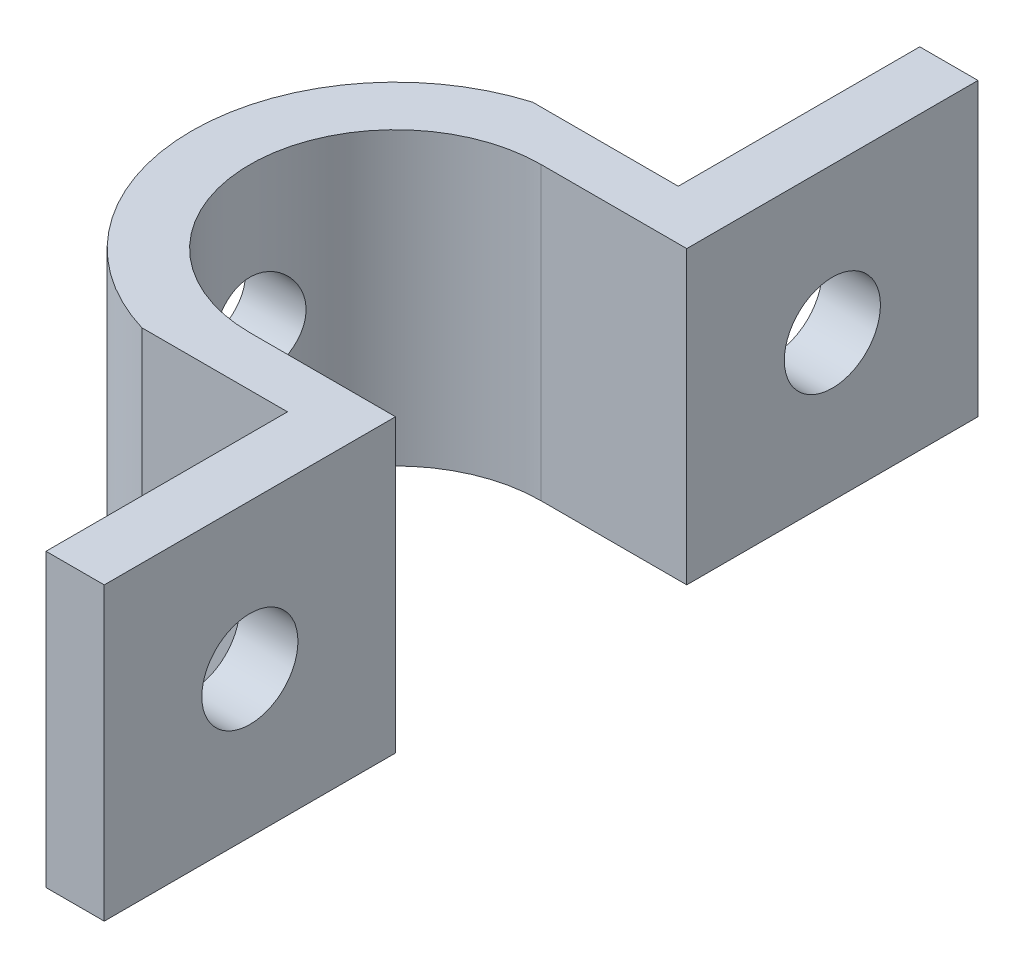
ISO-10303-21;
HEADER;
FILE_DESCRIPTION(('STEP AP214'),'2;1');
FILE_NAME('part.step','',(''),(''),'','','');
FILE_SCHEMA(('AUTOMOTIVE_DESIGN { 1 0 10303 214 1 1 1 1 }'));
ENDSEC;
DATA;
#1=APPLICATION_CONTEXT('core data for automotive mechanical design processes');
#2=APPLICATION_PROTOCOL_DEFINITION('international standard','automotive_design',2000,#1);
#3=PRODUCT_CONTEXT('',#1,'mechanical');
#4=PRODUCT('Part','Part','',(#3));
#5=PRODUCT_RELATED_PRODUCT_CATEGORY('part','',(#4));
#6=PRODUCT_DEFINITION_FORMATION('','',#4);
#7=PRODUCT_DEFINITION_CONTEXT('part definition',#1,'design');
#8=PRODUCT_DEFINITION('design','',#6,#7);
#9=PRODUCT_DEFINITION_SHAPE('','',#8);
#10=(LENGTH_UNIT() NAMED_UNIT(*) SI_UNIT(.MILLI.,.METRE.));
#11=(NAMED_UNIT(*) PLANE_ANGLE_UNIT() SI_UNIT($,.RADIAN.));
#12=(NAMED_UNIT(*) SI_UNIT($,.STERADIAN.) SOLID_ANGLE_UNIT());
#13=UNCERTAINTY_MEASURE_WITH_UNIT(LENGTH_MEASURE(1.E-05),#10,'distance_accuracy_value','');
#14=(GEOMETRIC_REPRESENTATION_CONTEXT(3) GLOBAL_UNCERTAINTY_ASSIGNED_CONTEXT((#13)) GLOBAL_UNIT_ASSIGNED_CONTEXT((#10,
#11,#12)) REPRESENTATION_CONTEXT('',''));
#15=CARTESIAN_POINT('',(0.,0.,0.));
#16=DIRECTION('',(0.,0.,1.));
#17=DIRECTION('',(1.,0.,0.));
#18=AXIS2_PLACEMENT_3D('',#15,#16,#17);
#19=CARTESIAN_POINT('',(-2.,10.,0.));
#20=DIRECTION('',(0.,0.,1.));
#21=DIRECTION('',(1.,0.,0.));
#22=AXIS2_PLACEMENT_3D('',#19,#20,#21);
#23=PLANE('',#22);
#24=DIRECTION('',(0.,-1.,0.));
#25=VECTOR('',#24,1.);
#26=CARTESIAN_POINT('',(3.,10.,0.));
#27=LINE('',#26,#25);
#28=CARTESIAN_POINT('',(3.,10.,0.));
#29=VERTEX_POINT('',#28);
#30=CARTESIAN_POINT('',(3.,0.,0.));
#31=VERTEX_POINT('',#30);
#32=EDGE_CURVE('E76',#29,#31,#27,.T.);
#33=ORIENTED_EDGE('',*,*,#32,.F.);
#34=DIRECTION('',(-1.,0.,0.));
#35=VECTOR('',#34,1.);
#36=CARTESIAN_POINT('',(-2.,10.,0.));
#37=LINE('',#36,#35);
#38=CARTESIAN_POINT('',(5.,10.,0.));
#39=VERTEX_POINT('',#38);
#40=EDGE_CURVE('E234',#39,#29,#37,.T.);
#41=ORIENTED_EDGE('',*,*,#40,.F.);
#42=DIRECTION('',(0.,1.,0.));
#43=VECTOR('',#42,1.);
#44=CARTESIAN_POINT('',(5.,0.,0.));
#45=LINE('',#44,#43);
#46=CARTESIAN_POINT('',(5.,0.,0.));
#47=VERTEX_POINT('',#46);
#48=EDGE_CURVE('E198',#47,#39,#45,.T.);
#49=ORIENTED_EDGE('',*,*,#48,.F.);
#50=DIRECTION('',(-1.,0.,0.));
#51=VECTOR('',#50,1.);
#52=CARTESIAN_POINT('',(-2.,0.,0.));
#53=LINE('',#52,#51);
#54=EDGE_CURVE('E213',#47,#31,#53,.T.);
#55=ORIENTED_EDGE('',*,*,#54,.T.);
#56=EDGE_LOOP('',(#33,#41,#49,#55));
#57=FACE_BOUND('',#56,.T.);
#58=ADVANCED_FACE('F47',(#57),#23,.F.);
#59=CARTESIAN_POINT('',(-2.,10.,30.));
#60=DIRECTION('',(0.,0.,-1.));
#61=DIRECTION('',(-1.,0.,0.));
#62=AXIS2_PLACEMENT_3D('',#59,#60,#61);
#63=PLANE('',#62);
#64=DIRECTION('',(0.,1.,0.));
#65=VECTOR('',#64,1.);
#66=CARTESIAN_POINT('',(3.,0.,30.));
#67=LINE('',#66,#65);
#68=CARTESIAN_POINT('',(3.,0.,30.));
#69=VERTEX_POINT('',#68);
#70=CARTESIAN_POINT('',(3.,10.,30.));
#71=VERTEX_POINT('',#70);
#72=EDGE_CURVE('E181',#69,#71,#67,.T.);
#73=ORIENTED_EDGE('',*,*,#72,.F.);
#74=DIRECTION('',(1.,0.,0.));
#75=VECTOR('',#74,1.);
#76=CARTESIAN_POINT('',(-2.,0.,30.));
#77=LINE('',#76,#75);
#78=CARTESIAN_POINT('',(5.,0.,30.));
#79=VERTEX_POINT('',#78);
#80=EDGE_CURVE('E254',#69,#79,#77,.T.);
#81=ORIENTED_EDGE('',*,*,#80,.T.);
#82=DIRECTION('',(0.,-1.,0.));
#83=VECTOR('',#82,1.);
#84=CARTESIAN_POINT('',(5.,10.,30.));
#85=LINE('',#84,#83);
#86=CARTESIAN_POINT('',(5.,10.,30.));
#87=VERTEX_POINT('',#86);
#88=EDGE_CURVE('E194',#87,#79,#85,.T.);
#89=ORIENTED_EDGE('',*,*,#88,.F.);
#90=DIRECTION('',(1.,0.,0.));
#91=VECTOR('',#90,1.);
#92=CARTESIAN_POINT('',(-2.,10.,30.));
#93=LINE('',#92,#91);
#94=EDGE_CURVE('E243',#71,#87,#93,.T.);
#95=ORIENTED_EDGE('',*,*,#94,.F.);
#96=EDGE_LOOP('',(#73,#81,#89,#95));
#97=FACE_BOUND('',#96,.T.);
#98=ADVANCED_FACE('F355',(#97),#63,.F.);
#99=CARTESIAN_POINT('',(0.,10.,15.));
#100=DIRECTION('',(0.,-1.,0.));
#101=DIRECTION('',(0.,0.,-1.));
#102=AXIS2_PLACEMENT_3D('',#99,#100,#101);
#103=CYLINDRICAL_SURFACE('',#102,7.);
#104=CARTESIAN_POINT('',(-6.80275679412398,5.,16.65));
#105=CARTESIAN_POINT('',(-6.80275861136205,4.90871099997652,16.6499971300732));
#106=CARTESIAN_POINT('',(-6.80461440498174,4.81738900161891,16.6423981344));
#107=CARTESIAN_POINT('',(-6.81182064992733,4.63735543656597,16.612244147676));
#108=CARTESIAN_POINT('',(-6.81717336620826,4.54864560071145,16.5896794632121));
#109=CARTESIAN_POINT('',(-6.83073431325551,4.37646648747663,16.5303551503609));
#110=CARTESIAN_POINT('',(-6.83893911932177,4.29299106604051,16.4936125405845));
#111=CARTESIAN_POINT('',(-6.85727558075245,4.13338346720995,16.4070258185496));
#112=CARTESIAN_POINT('',(-6.86740726130097,4.05725138581207,16.3571815350499));
#113=CARTESIAN_POINT('',(-6.88867782513987,3.91300017131405,16.2447646190835));
#114=CARTESIAN_POINT('',(-6.89983131541127,3.84504595472281,16.1819830935587));
#115=CARTESIAN_POINT('',(-6.92176152937785,3.72052828829883,16.0459242729893));
#116=CARTESIAN_POINT('',(-6.93253822068664,3.66396581562248,15.9726460784875));
#117=CARTESIAN_POINT('',(-6.95266103704034,3.56317303018273,15.816555491677));
#118=CARTESIAN_POINT('',(-6.96198791366554,3.51910313876716,15.7336368144797));
#119=CARTESIAN_POINT('',(-6.97799434603916,3.44558709172224,15.5613128385626));
#120=CARTESIAN_POINT('',(-6.98467424785277,3.41613902430984,15.4719083896014));
#121=CARTESIAN_POINT('',(-6.99453084372035,3.37322629782888,15.2908680220524));
#122=CARTESIAN_POINT('',(-6.99776875317269,3.35948200603305,15.1993017757155));
#123=CARTESIAN_POINT('',(-7.00058928212562,3.34749086323874,15.0151097839079));
#124=CARTESIAN_POINT('',(-7.00017238432294,3.34924196573697,14.9224841799622));
#125=CARTESIAN_POINT('',(-6.99577641572094,3.36798740501016,14.74073663216));
#126=CARTESIAN_POINT('',(-6.99186783471482,3.38468011500454,14.6515816196809));
#127=CARTESIAN_POINT('',(-6.98100889430398,3.43235207443573,14.4773753750162));
#128=CARTESIAN_POINT('',(-6.97405838372646,3.46333203390087,14.3923243470169));
#129=CARTESIAN_POINT('',(-6.95778608866946,3.53895377039328,14.2279256132054));
#130=CARTESIAN_POINT('',(-6.94844521053821,3.58370617046967,14.148630760275));
#131=CARTESIAN_POINT('',(-6.92841069918988,3.685519225885,13.998568639297));
#132=CARTESIAN_POINT('',(-6.91771685448099,3.74258180650105,13.92780270785));
#133=CARTESIAN_POINT('',(-6.89584251761335,3.86902452509401,13.7950103439417));
#134=CARTESIAN_POINT('',(-6.88465650871199,3.93866849569449,13.7332357899427));
#135=CARTESIAN_POINT('',(-6.86329717958811,4.0874443211498,13.6221906360801));
#136=CARTESIAN_POINT('',(-6.85312389657327,4.16657652436841,13.5729204955273));
#137=CARTESIAN_POINT('',(-6.83492437266263,4.33253525980705,13.4881452284223));
#138=CARTESIAN_POINT('',(-6.82690665922475,4.41939059395085,13.4526945301079));
#139=CARTESIAN_POINT('',(-6.8140390867396,4.59806127756916,13.3969722848722));
#140=CARTESIAN_POINT('',(-6.80918863409247,4.68987569413077,13.3766978935421));
#141=CARTESIAN_POINT('',(-6.80332774943589,4.87353855694924,13.3523087210196));
#142=CARTESIAN_POINT('',(-6.80222947433876,4.96533515973006,13.3478242013954));
#143=CARTESIAN_POINT('',(-6.80375919481422,5.14836457658374,13.3541351120498));
#144=CARTESIAN_POINT('',(-6.80638688917233,5.23959743563189,13.3649293071677));
#145=CARTESIAN_POINT('',(-6.81498886694796,5.41757745074747,13.4011685953919));
#146=CARTESIAN_POINT('',(-6.82091521063605,5.50436984565375,13.4264039574829));
#147=CARTESIAN_POINT('',(-6.83540229380027,5.67249368663451,13.4905793012613));
#148=CARTESIAN_POINT('',(-6.84396331787599,5.75382454159378,13.5295207635542));
#149=CARTESIAN_POINT('',(-6.86294389007106,5.91029905658938,13.6207958904044));
#150=CARTESIAN_POINT('',(-6.87339357272798,5.98530818474253,13.6733537849148));
#151=CARTESIAN_POINT('',(-6.89489755256543,6.12557800629822,13.7900817098675));
#152=CARTESIAN_POINT('',(-6.90595193742742,6.19083728083161,13.854253427438));
#153=CARTESIAN_POINT('',(-6.92771364919943,6.31122298204255,13.9940731838202));
#154=CARTESIAN_POINT('',(-6.93840801965822,6.36609535547159,14.0699423397795));
#155=CARTESIAN_POINT('',(-6.95799159344945,6.46231801677791,14.2300347792411));
#156=CARTESIAN_POINT('',(-6.96688088727282,6.50366898256505,14.3142576436454));
#157=CARTESIAN_POINT('',(-6.98179887024889,6.57133783893331,14.4881057278654));
#158=CARTESIAN_POINT('',(-6.98784709878863,6.59775867456761,14.577689122752));
#159=CARTESIAN_POINT('',(-6.99648655479454,6.63513286894146,14.7601837980261));
#160=CARTESIAN_POINT('',(-6.99907837091255,6.64608886147333,14.8530945089796));
#161=CARTESIAN_POINT('',(-7.00049202890772,6.65208813057133,15.0372082467747));
#162=CARTESIAN_POINT('',(-6.9994031706394,6.64750832426096,15.1283985042107));
#163=CARTESIAN_POINT('',(-6.99377268350157,6.62341975270527,15.3086707298165));
#164=CARTESIAN_POINT('',(-6.98923113721447,6.60391134452658,15.3977527483593));
#165=CARTESIAN_POINT('',(-6.97721604451342,6.55071176108928,15.5709335768956));
#166=CARTESIAN_POINT('',(-6.96975517685192,6.51708187051132,15.6550521493591));
#167=CARTESIAN_POINT('',(-6.95269208722048,6.4366509910792,15.8164987953648));
#168=CARTESIAN_POINT('',(-6.94308962308135,6.38984851252764,15.893826099579));
#169=CARTESIAN_POINT('',(-6.92252474173611,6.28321390355334,16.0413072599721));
#170=CARTESIAN_POINT('',(-6.91153737485731,6.22312153020512,16.1112694814733));
#171=CARTESIAN_POINT('',(-6.88956325338245,6.09212760248887,16.2402452333942));
#172=CARTESIAN_POINT('',(-6.87857649960749,6.02122338274089,16.299256056056));
#173=CARTESIAN_POINT('',(-6.85764827463158,5.86924540614473,16.4055784964365));
#174=CARTESIAN_POINT('',(-6.84772646444862,5.7880263885213,16.4526866153972));
#175=CARTESIAN_POINT('',(-6.83030721412674,5.61860266624687,16.532509311262));
#176=CARTESIAN_POINT('',(-6.82280787287529,5.53040350750556,16.5652351824176));
#177=CARTESIAN_POINT('',(-6.81235745600281,5.36853084559052,16.6100284268064));
#178=CARTESIAN_POINT('',(-6.80878274857867,5.29568399515568,16.6249870041652));
#179=CARTESIAN_POINT('',(-6.8039817559383,5.14856531846772,16.644973629764));
#180=CARTESIAN_POINT('',(-6.80275531520391,5.07429358690895,16.6500023356282));
#181=CARTESIAN_POINT('',(-6.80275679412398,5.,16.65));
#182=B_SPLINE_CURVE_WITH_KNOTS('',3,(#104,#105,#106,#107,#108,#109,#110,#111,#112,#113,#114,
#115,#116,#117,#118,#119,#120,#121,#122,#123,#124,#125,#126,#127,#128,#129,#130,#131,#132,#133,
#134,#135,#136,#137,#138,#139,#140,#141,#142,#143,#144,#145,#146,#147,#148,#149,#150,#151,#152,
#153,#154,#155,#156,#157,#158,#159,#160,#161,#162,#163,#164,#165,#166,#167,#168,#169,#170,#171,
#172,#173,#174,#175,#176,#177,#178,#179,#180,#181),.UNSPECIFIED.,.T.,.F.,(4,2,2,2,2,2,2,2,2,2,2,
2,2,2,2,2,2,2,2,2,2,2,2,2,2,2,2,2,2,2,2,2,2,2,2,2,2,2,4),(0.,0.273594440399258,
0.547366263700774,0.820810479503747,1.0942582694491,1.37252656286893,1.65081871531698,
1.93253747960749,2.21421939985748,2.49080324523182,2.76735056224876,3.03843805884697,
3.30953902903524,3.5828770280852,3.85625780745004,4.13623055025586,4.41621357550839,
4.69728844125184,4.97831061353603,5.25270687968444,5.52708096437946,5.79756789407088,
6.06808405216623,6.34337456664897,6.61870510445458,6.90008328124663,7.18144734868653,
7.46084693391316,7.74019892930651,8.01282246332762,8.28543947686365,8.55688541369867,
8.82836206089265,9.10571835709369,9.38314313916058,9.66503130549495,9.9466977102697,
10.1693714016501,10.3920303455577),.UNSPECIFIED.);
#183=CARTESIAN_POINT('',(-6.80275679412398,5.,16.65));
#184=VERTEX_POINT('',#183);
#185=EDGE_CURVE('E296',#184,#184,#182,.T.);
#186=ORIENTED_EDGE('',*,*,#185,.T.);
#187=EDGE_LOOP('',(#186));
#188=FACE_BOUND('',#187,.T.);
#189=CARTESIAN_POINT('',(0.,0.,15.));
#190=DIRECTION('',(0.,1.,0.));
#191=DIRECTION('',(0.,0.,1.));
#192=AXIS2_PLACEMENT_3D('',#189,#190,#191);
#193=CIRCLE('',#192,7.);
#194=CARTESIAN_POINT('',(-2.,0.,8.29179606750063));
#195=VERTEX_POINT('',#194);
#196=CARTESIAN_POINT('',(-2.,0.,21.7082039324994));
#197=VERTEX_POINT('',#196);
#198=EDGE_CURVE('E162',#195,#197,#193,.T.);
#199=ORIENTED_EDGE('',*,*,#198,.T.);
#200=DIRECTION('',(0.,-1.,0.));
#201=VECTOR('',#200,1.);
#202=CARTESIAN_POINT('',(-2.,10.,21.7082039324994));
#203=LINE('',#202,#201);
#204=CARTESIAN_POINT('',(-2.,10.,21.7082039324994));
#205=VERTEX_POINT('',#204);
#206=EDGE_CURVE('E61',#205,#197,#203,.T.);
#207=ORIENTED_EDGE('',*,*,#206,.F.);
#208=CARTESIAN_POINT('',(0.,10.,15.));
#209=DIRECTION('',(0.,1.,0.));
#210=DIRECTION('',(0.,0.,1.));
#211=AXIS2_PLACEMENT_3D('',#208,#209,#210);
#212=CIRCLE('',#211,7.);
#213=CARTESIAN_POINT('',(-2.,10.,8.29179606750063));
#214=VERTEX_POINT('',#213);
#215=EDGE_CURVE('E238',#214,#205,#212,.T.);
#216=ORIENTED_EDGE('',*,*,#215,.F.);
#217=DIRECTION('',(0.,-1.,0.));
#218=VECTOR('',#217,1.);
#219=CARTESIAN_POINT('',(-2.,10.,8.29179606750063));
#220=LINE('',#219,#218);
#221=EDGE_CURVE('E11',#214,#195,#220,.T.);
#222=ORIENTED_EDGE('',*,*,#221,.T.);
#223=EDGE_LOOP('',(#199,#207,#216,#222));
#224=FACE_BOUND('',#223,.T.);
#225=ADVANCED_FACE('F275',(#188,#224),#103,.T.);
#226=CARTESIAN_POINT('',(0.,10.,15.));
#227=DIRECTION('',(0.,-1.,0.));
#228=DIRECTION('',(0.,0.,-1.));
#229=AXIS2_PLACEMENT_3D('',#226,#227,#228);
#230=CYLINDRICAL_SURFACE('',#229,5.);
#231=CARTESIAN_POINT('',(-4.71990466005406,5.,16.65));
#232=CARTESIAN_POINT('',(-4.71990452115883,5.08992939929063,16.650000243605));
#233=CARTESIAN_POINT('',(-4.72250292266519,5.17985768649969,16.6426230381865));
#234=CARTESIAN_POINT('',(-4.73256311651638,5.35705367343518,16.6134061681748));
#235=CARTESIAN_POINT('',(-4.74002579119603,5.4443208874604,16.5915638797359));
#236=CARTESIAN_POINT('',(-4.75887919770347,5.61359969937908,16.5342646581981));
#237=CARTESIAN_POINT('',(-4.77026235105614,5.69562107766353,16.4988339772241));
#238=CARTESIAN_POINT('',(-4.79566317693293,5.85258149635711,16.4154530353585));
#239=CARTESIAN_POINT('',(-4.80968141232602,5.92751901846369,16.3675000987865));
#240=CARTESIAN_POINT('',(-4.83937566103107,6.07105763938825,16.2584665430876));
#241=CARTESIAN_POINT('',(-4.85509238793419,6.13934748573353,16.1969871597991));
#242=CARTESIAN_POINT('',(-4.88606822622471,6.26485926767889,16.0634972766317));
#243=CARTESIAN_POINT('',(-4.90132726544299,6.322079465466,15.9914851263355));
#244=CARTESIAN_POINT('',(-4.93013890958224,6.42523358902282,15.8367042156024));
#245=CARTESIAN_POINT('',(-4.94363804307574,6.47084230640669,15.7537078872784));
#246=CARTESIAN_POINT('',(-4.9669298740668,6.54732873484977,15.5806996850409));
#247=CARTESIAN_POINT('',(-4.97672354920831,6.57821033205655,15.4906896691795));
#248=CARTESIAN_POINT('',(-4.99121262924258,6.62331307187515,15.3094718310711));
#249=CARTESIAN_POINT('',(-4.99607073696453,6.63806721498854,15.2184099163068));
#250=CARTESIAN_POINT('',(-5.00071837425094,6.65218999871481,15.0349820134684));
#251=CARTESIAN_POINT('',(-5.00050918484354,6.65156252784608,14.9426163608841));
#252=CARTESIAN_POINT('',(-4.99515654976729,6.63528002545685,14.7629720669061));
#253=CARTESIAN_POINT('',(-4.99020313675408,6.6202037350628,14.6756343840473));
#254=CARTESIAN_POINT('',(-4.9761564157389,6.57640739681431,14.504806422331));
#255=CARTESIAN_POINT('',(-4.96706282865059,6.54768642917574,14.4213164032597));
#256=CARTESIAN_POINT('',(-4.94551338736031,6.47707262193577,14.2592768953069));
#257=CARTESIAN_POINT('',(-4.93301533884174,6.43501331574259,14.1808057924134));
#258=CARTESIAN_POINT('',(-4.90596050876768,6.33905332496135,14.0318625999836));
#259=CARTESIAN_POINT('',(-4.89140316323876,6.28514939427669,13.9613927112778));
#260=CARTESIAN_POINT('',(-4.86097294536879,6.16410482353283,13.8270082474127));
#261=CARTESIAN_POINT('',(-4.84507036749807,6.09646769426565,13.7635469540563));
#262=CARTESIAN_POINT('',(-4.81431124792123,5.95137341036443,13.6487229961694));
#263=CARTESIAN_POINT('',(-4.79945486104327,5.87391480695885,13.5973621197797));
#264=CARTESIAN_POINT('',(-4.77230967313123,5.70996560114244,13.5075861767389));
#265=CARTESIAN_POINT('',(-4.76005891661915,5.62336561233863,13.4693584945687));
#266=CARTESIAN_POINT('',(-4.73995346804782,5.44445239284249,13.4081801822624));
#267=CARTESIAN_POINT('',(-4.73209697762928,5.35214151654173,13.3852233018009));
#268=CARTESIAN_POINT('',(-4.72207527963097,5.16880983230075,13.3561531740768));
#269=CARTESIAN_POINT('',(-4.71967327795615,5.0779131556508,13.3493385439829));
#270=CARTESIAN_POINT('',(-4.7201713665852,4.89626215211207,13.3507625050791));
#271=CARTESIAN_POINT('',(-4.72307051828915,4.80550780287081,13.3589984314808));
#272=CARTESIAN_POINT('',(-4.73360855675225,4.62987992776333,13.3896600287622));
#273=CARTESIAN_POINT('',(-4.74108573426459,4.54491123060324,13.4116020728041));
#274=CARTESIAN_POINT('',(-4.75976051805482,4.37987739298326,13.468474771533));
#275=CARTESIAN_POINT('',(-4.77095877549975,4.2998131136739,13.5034076996758));
#276=CARTESIAN_POINT('',(-4.79624726899171,4.14408997295919,13.5865115743525));
#277=CARTESIAN_POINT('',(-4.81041691149477,4.06864683097438,13.6350619330135));
#278=CARTESIAN_POINT('',(-4.83989585604412,3.92672439625333,13.7435904200953));
#279=CARTESIAN_POINT('',(-4.85520548680903,3.86024770467313,13.8035718525317));
#280=CARTESIAN_POINT('',(-4.88610989384612,3.73491681921652,13.9366087615796));
#281=CARTESIAN_POINT('',(-4.90168425037641,3.67656776107347,14.0101462360769));
#282=CARTESIAN_POINT('',(-4.93065204495412,3.57300735840891,14.1663508226466));
#283=CARTESIAN_POINT('',(-4.94404556482344,3.52779552094755,14.2490175920054));
#284=CARTESIAN_POINT('',(-4.96707750850083,3.45221100774121,14.4207042846202));
#285=CARTESIAN_POINT('',(-4.976740841375,3.42173954125647,14.5096771970414));
#286=CARTESIAN_POINT('',(-4.99133146825929,3.37631330680774,14.6918652641417));
#287=CARTESIAN_POINT('',(-4.99626043401974,3.36135306153476,14.7850789091914));
#288=CARTESIAN_POINT('',(-5.00070328980923,3.34785918214313,14.9684774135301));
#289=CARTESIAN_POINT('',(-5.00045646732494,3.34859968791082,15.0586036580669));
#290=CARTESIAN_POINT('',(-4.99516201889143,3.36470152427364,15.2373880282905));
#291=CARTESIAN_POINT('',(-4.99011476942583,3.38006170828971,15.326046268554));
#292=CARTESIAN_POINT('',(-4.97587240449466,3.42448830592424,15.4980296657855));
#293=CARTESIAN_POINT('',(-4.96674195827476,3.45334133491917,15.5814156803772));
#294=CARTESIAN_POINT('',(-4.94527347683187,3.52373789478141,15.7421968074289));
#295=CARTESIAN_POINT('',(-4.93293486552038,3.56528370511945,15.8195908406695));
#296=CARTESIAN_POINT('',(-4.90576374946711,3.66163265392507,15.969268380933));
#297=CARTESIAN_POINT('',(-4.8908566849274,3.71686414809695,16.0412624426929));
#298=CARTESIAN_POINT('',(-4.86041514438607,3.8382836506441,16.1751981855517));
#299=CARTESIAN_POINT('',(-4.84488047141097,3.90447511929778,16.2371366796408));
#300=CARTESIAN_POINT('',(-4.81423121094683,4.04895585145464,16.3516017981425));
#301=CARTESIAN_POINT('',(-4.79915525016869,4.12761026948916,16.4036792928643));
#302=CARTESIAN_POINT('',(-4.7718636868793,4.29302166212418,16.4938362822388));
#303=CARTESIAN_POINT('',(-4.759647267495,4.37977631283495,16.5319197762739));
#304=CARTESIAN_POINT('',(-4.74014636717988,4.55434327244323,16.5912073476447));
#305=CARTESIAN_POINT('',(-4.7326392026776,4.64186804193521,16.6131835519048));
#306=CARTESIAN_POINT('',(-4.7225192193515,4.81959617129269,16.6425773745118));
#307=CARTESIAN_POINT('',(-4.71990479936932,4.90979864505526,16.6499997556583));
#308=CARTESIAN_POINT('',(-4.71990466005406,5.,16.65));
#309=B_SPLINE_CURVE_WITH_KNOTS('',3,(#231,#232,#233,#234,#235,#236,#237,#238,#239,#240,#241,
#242,#243,#244,#245,#246,#247,#248,#249,#250,#251,#252,#253,#254,#255,#256,#257,#258,#259,#260,
#261,#262,#263,#264,#265,#266,#267,#268,#269,#270,#271,#272,#273,#274,#275,#276,#277,#278,#279,
#280,#281,#282,#283,#284,#285,#286,#287,#288,#289,#290,#291,#292,#293,#294,#295,#296,#297,#298,
#299,#300,#301,#302,#303,#304,#305,#306,#307,#308),.UNSPECIFIED.,.T.,.F.,(4,2,2,2,2,2,2,2,2,2,2,
2,2,2,2,2,2,2,2,2,2,2,2,2,2,2,2,2,2,2,2,2,2,2,2,2,2,2,4),(0.,0.269454302916435,
0.538957495994025,0.807942623457632,1.07698527314817,1.3553904348317,1.63383926765626,
1.91939248597707,2.2048703116341,2.48059787689522,2.75625573811558,3.02131448573183,
3.28639110342469,3.55491555402299,3.82351368748603,4.10452131305698,4.38557043856028,
4.67047751353534,4.95526790443248,5.22743703243199,5.49955797597573,5.76258081799807,
6.02564971172707,6.29693565916083,6.56830013781585,6.85241935986189,7.13652791970021,
7.41870503995781,7.70078248410447,7.96984890311455,8.23889422176275,8.50382155957889,
8.76879650315115,9.04343817678385,9.31816672608183,9.60337461850677,9.88850093710113,
10.1588585876967,10.4291277478431),.UNSPECIFIED.);
#310=CARTESIAN_POINT('',(-4.71990466005406,5.,16.65));
#311=VERTEX_POINT('',#310);
#312=EDGE_CURVE('E50',#311,#311,#309,.T.);
#313=ORIENTED_EDGE('',*,*,#312,.T.);
#314=EDGE_LOOP('',(#313));
#315=FACE_BOUND('',#314,.T.);
#316=CARTESIAN_POINT('',(0.,0.,15.));
#317=DIRECTION('',(0.,-1.,0.));
#318=DIRECTION('',(0.,0.,1.));
#319=AXIS2_PLACEMENT_3D('',#316,#317,#318);
#320=CIRCLE('',#319,5.);
#321=CARTESIAN_POINT('',(0.,0.,20.));
#322=VERTEX_POINT('',#321);
#323=CARTESIAN_POINT('',(0.,0.,10.));
#324=VERTEX_POINT('',#323);
#325=EDGE_CURVE('E239',#322,#324,#320,.T.);
#326=ORIENTED_EDGE('',*,*,#325,.T.);
#327=DIRECTION('',(0.,-1.,0.));
#328=VECTOR('',#327,1.);
#329=CARTESIAN_POINT('',(0.,10.,10.));
#330=LINE('',#329,#328);
#331=CARTESIAN_POINT('',(0.,10.,10.));
#332=VERTEX_POINT('',#331);
#333=EDGE_CURVE('E249',#332,#324,#330,.T.);
#334=ORIENTED_EDGE('',*,*,#333,.F.);
#335=CARTESIAN_POINT('',(0.,10.,15.));
#336=DIRECTION('',(0.,-1.,0.));
#337=DIRECTION('',(0.,0.,1.));
#338=AXIS2_PLACEMENT_3D('',#335,#336,#337);
#339=CIRCLE('',#338,5.);
#340=CARTESIAN_POINT('',(0.,10.,20.));
#341=VERTEX_POINT('',#340);
#342=EDGE_CURVE('E246',#341,#332,#339,.T.);
#343=ORIENTED_EDGE('',*,*,#342,.F.);
#344=DIRECTION('',(0.,-1.,0.));
#345=VECTOR('',#344,1.);
#346=CARTESIAN_POINT('',(0.,10.,20.));
#347=LINE('',#346,#345);
#348=EDGE_CURVE('E262',#341,#322,#347,.T.);
#349=ORIENTED_EDGE('',*,*,#348,.T.);
#350=EDGE_LOOP('',(#326,#334,#343,#349));
#351=FACE_BOUND('',#350,.T.);
#352=ADVANCED_FACE('F350',(#315,#351),#230,.F.);
#353=CARTESIAN_POINT('',(0.,10.,15.));
#354=DIRECTION('',(0.,1.,0.));
#355=DIRECTION('',(0.,0.,1.));
#356=AXIS2_PLACEMENT_3D('',#353,#354,#355);
#357=PLANE('',#356);
#358=DIRECTION('',(-1.,0.,0.));
#359=VECTOR('',#358,1.);
#360=CARTESIAN_POINT('',(3.,10.,8.29179606750063));
#361=LINE('',#360,#359);
#362=CARTESIAN_POINT('',(3.,10.,8.29179606750063));
#363=VERTEX_POINT('',#362);
#364=EDGE_CURVE('E147',#363,#214,#361,.T.);
#365=ORIENTED_EDGE('',*,*,#364,.T.);
#366=ORIENTED_EDGE('',*,*,#215,.T.);
#367=DIRECTION('',(-1.,0.,0.));
#368=VECTOR('',#367,1.);
#369=CARTESIAN_POINT('',(3.,10.,21.7082039324994));
#370=LINE('',#369,#368);
#371=CARTESIAN_POINT('',(3.,10.,21.7082039324994));
#372=VERTEX_POINT('',#371);
#373=EDGE_CURVE('E175',#372,#205,#370,.T.);
#374=ORIENTED_EDGE('',*,*,#373,.F.);
#375=DIRECTION('',(0.,0.,-1.));
#376=VECTOR('',#375,1.);
#377=CARTESIAN_POINT('',(3.,10.,30.));
#378=LINE('',#377,#376);
#379=EDGE_CURVE('E174',#71,#372,#378,.T.);
#380=ORIENTED_EDGE('',*,*,#379,.F.);
#381=ORIENTED_EDGE('',*,*,#94,.T.);
#382=DIRECTION('',(0.,0.,1.));
#383=VECTOR('',#382,1.);
#384=CARTESIAN_POINT('',(5.,10.,20.));
#385=LINE('',#384,#383);
#386=CARTESIAN_POINT('',(5.,10.,20.));
#387=VERTEX_POINT('',#386);
#388=EDGE_CURVE('E221',#387,#87,#385,.T.);
#389=ORIENTED_EDGE('',*,*,#388,.F.);
#390=DIRECTION('',(-1.,0.,0.));
#391=VECTOR('',#390,1.);
#392=CARTESIAN_POINT('',(5.,10.,20.));
#393=LINE('',#392,#391);
#394=EDGE_CURVE('E217',#387,#341,#393,.T.);
#395=ORIENTED_EDGE('',*,*,#394,.T.);
#396=ORIENTED_EDGE('',*,*,#342,.T.);
#397=DIRECTION('',(-1.,0.,0.));
#398=VECTOR('',#397,1.);
#399=CARTESIAN_POINT('',(5.,10.,10.));
#400=LINE('',#399,#398);
#401=CARTESIAN_POINT('',(5.,10.,10.));
#402=VERTEX_POINT('',#401);
#403=EDGE_CURVE('E205',#402,#332,#400,.T.);
#404=ORIENTED_EDGE('',*,*,#403,.F.);
#405=DIRECTION('',(0.,0.,1.));
#406=VECTOR('',#405,1.);
#407=CARTESIAN_POINT('',(5.,10.,0.));
#408=LINE('',#407,#406);
#409=EDGE_CURVE('E202',#39,#402,#408,.T.);
#410=ORIENTED_EDGE('',*,*,#409,.F.);
#411=ORIENTED_EDGE('',*,*,#40,.T.);
#412=DIRECTION('',(0.,0.,-1.));
#413=VECTOR('',#412,1.);
#414=CARTESIAN_POINT('',(3.,10.,8.29179606750063));
#415=LINE('',#414,#413);
#416=EDGE_CURVE('E150',#363,#29,#415,.T.);
#417=ORIENTED_EDGE('',*,*,#416,.F.);
#418=EDGE_LOOP('',(#365,#366,#374,#380,#381,#389,#395,#396,#404,#410,#411,#417));
#419=FACE_BOUND('',#418,.T.);
#420=ADVANCED_FACE('F277',(#419),#357,.T.);
#421=CARTESIAN_POINT('',(0.,0.,15.));
#422=DIRECTION('',(0.,1.,0.));
#423=DIRECTION('',(0.,0.,1.));
#424=AXIS2_PLACEMENT_3D('',#421,#422,#423);
#425=PLANE('',#424);
#426=ORIENTED_EDGE('',*,*,#198,.F.);
#427=DIRECTION('',(-1.,0.,0.));
#428=VECTOR('',#427,1.);
#429=CARTESIAN_POINT('',(3.,0.,8.29179606750063));
#430=LINE('',#429,#428);
#431=CARTESIAN_POINT('',(3.,0.,8.29179606750063));
#432=VERTEX_POINT('',#431);
#433=EDGE_CURVE('E145',#432,#195,#430,.T.);
#434=ORIENTED_EDGE('',*,*,#433,.F.);
#435=DIRECTION('',(0.,0.,1.));
#436=VECTOR('',#435,1.);
#437=CARTESIAN_POINT('',(3.,0.,0.));
#438=LINE('',#437,#436);
#439=EDGE_CURVE('E151',#31,#432,#438,.T.);
#440=ORIENTED_EDGE('',*,*,#439,.F.);
#441=ORIENTED_EDGE('',*,*,#54,.F.);
#442=DIRECTION('',(0.,0.,-1.));
#443=VECTOR('',#442,1.);
#444=CARTESIAN_POINT('',(5.,0.,10.));
#445=LINE('',#444,#443);
#446=CARTESIAN_POINT('',(5.,0.,10.));
#447=VERTEX_POINT('',#446);
#448=EDGE_CURVE('E193',#447,#47,#445,.T.);
#449=ORIENTED_EDGE('',*,*,#448,.F.);
#450=DIRECTION('',(-1.,0.,0.));
#451=VECTOR('',#450,1.);
#452=CARTESIAN_POINT('',(5.,0.,10.));
#453=LINE('',#452,#451);
#454=EDGE_CURVE('E209',#447,#324,#453,.T.);
#455=ORIENTED_EDGE('',*,*,#454,.T.);
#456=ORIENTED_EDGE('',*,*,#325,.F.);
#457=DIRECTION('',(-1.,0.,0.));
#458=VECTOR('',#457,1.);
#459=CARTESIAN_POINT('',(5.,0.,20.));
#460=LINE('',#459,#458);
#461=CARTESIAN_POINT('',(5.,0.,20.));
#462=VERTEX_POINT('',#461);
#463=EDGE_CURVE('E167',#462,#322,#460,.T.);
#464=ORIENTED_EDGE('',*,*,#463,.F.);
#465=DIRECTION('',(0.,0.,-1.));
#466=VECTOR('',#465,1.);
#467=CARTESIAN_POINT('',(5.,0.,30.));
#468=LINE('',#467,#466);
#469=EDGE_CURVE('E228',#79,#462,#468,.T.);
#470=ORIENTED_EDGE('',*,*,#469,.F.);
#471=ORIENTED_EDGE('',*,*,#80,.F.);
#472=DIRECTION('',(0.,0.,1.));
#473=VECTOR('',#472,1.);
#474=CARTESIAN_POINT('',(3.,0.,21.7082039324994));
#475=LINE('',#474,#473);
#476=CARTESIAN_POINT('',(3.,0.,21.7082039324994));
#477=VERTEX_POINT('',#476);
#478=EDGE_CURVE('E184',#477,#69,#475,.T.);
#479=ORIENTED_EDGE('',*,*,#478,.F.);
#480=DIRECTION('',(-1.,0.,0.));
#481=VECTOR('',#480,1.);
#482=CARTESIAN_POINT('',(3.,0.,21.7082039324994));
#483=LINE('',#482,#481);
#484=EDGE_CURVE('E171',#477,#197,#483,.T.);
#485=ORIENTED_EDGE('',*,*,#484,.T.);
#486=EDGE_LOOP('',(#426,#434,#440,#441,#449,#455,#456,#464,#470,#471,#479,#485));
#487=FACE_BOUND('',#486,.T.);
#488=ADVANCED_FACE('F159',(#487),#425,.F.);
#489=CARTESIAN_POINT('',(5.,0.,20.));
#490=DIRECTION('',(0.,0.,1.));
#491=DIRECTION('',(1.,0.,0.));
#492=AXIS2_PLACEMENT_3D('',#489,#490,#491);
#493=PLANE('',#492);
#494=ORIENTED_EDGE('',*,*,#348,.F.);
#495=ORIENTED_EDGE('',*,*,#394,.F.);
#496=DIRECTION('',(0.,1.,0.));
#497=VECTOR('',#496,1.);
#498=CARTESIAN_POINT('',(5.,0.,20.));
#499=LINE('',#498,#497);
#500=EDGE_CURVE('E225',#462,#387,#499,.T.);
#501=ORIENTED_EDGE('',*,*,#500,.F.);
#502=ORIENTED_EDGE('',*,*,#463,.T.);
#503=EDGE_LOOP('',(#494,#495,#501,#502));
#504=FACE_BOUND('',#503,.T.);
#505=ADVANCED_FACE('F341',(#504),#493,.F.);
#506=CARTESIAN_POINT('',(5.,0.,0.));
#507=DIRECTION('',(1.,0.,0.));
#508=DIRECTION('',(0.,0.,-1.));
#509=AXIS2_PLACEMENT_3D('',#506,#507,#508);
#510=PLANE('',#509);
#511=CARTESIAN_POINT('',(5.,5.,25.));
#512=DIRECTION('',(1.,0.,0.));
#513=DIRECTION('',(0.,0.,-1.));
#514=AXIS2_PLACEMENT_3D('',#511,#512,#513);
#515=CIRCLE('',#514,1.65);
#516=CARTESIAN_POINT('',(5.,5.,23.35));
#517=VERTEX_POINT('',#516);
#518=EDGE_CURVE('E178',#517,#517,#515,.T.);
#519=ORIENTED_EDGE('',*,*,#518,.F.);
#520=EDGE_LOOP('',(#519));
#521=FACE_BOUND('',#520,.T.);
#522=ORIENTED_EDGE('',*,*,#88,.T.);
#523=ORIENTED_EDGE('',*,*,#469,.T.);
#524=ORIENTED_EDGE('',*,*,#500,.T.);
#525=ORIENTED_EDGE('',*,*,#388,.T.);
#526=EDGE_LOOP('',(#522,#523,#524,#525));
#527=FACE_BOUND('',#526,.T.);
#528=ADVANCED_FACE('F339',(#521,#527),#510,.T.);
#529=CARTESIAN_POINT('',(5.,10.,10.));
#530=DIRECTION('',(0.,0.,-1.));
#531=DIRECTION('',(-1.,0.,0.));
#532=AXIS2_PLACEMENT_3D('',#529,#530,#531);
#533=PLANE('',#532);
#534=ORIENTED_EDGE('',*,*,#333,.T.);
#535=ORIENTED_EDGE('',*,*,#454,.F.);
#536=DIRECTION('',(0.,-1.,0.));
#537=VECTOR('',#536,1.);
#538=CARTESIAN_POINT('',(5.,10.,10.));
#539=LINE('',#538,#537);
#540=EDGE_CURVE('E189',#402,#447,#539,.T.);
#541=ORIENTED_EDGE('',*,*,#540,.F.);
#542=ORIENTED_EDGE('',*,*,#403,.T.);
#543=EDGE_LOOP('',(#534,#535,#541,#542));
#544=FACE_BOUND('',#543,.T.);
#545=ADVANCED_FACE('F335',(#544),#533,.F.);
#546=CARTESIAN_POINT('',(5.,0.,0.));
#547=DIRECTION('',(1.,0.,0.));
#548=DIRECTION('',(0.,0.,-1.));
#549=AXIS2_PLACEMENT_3D('',#546,#547,#548);
#550=PLANE('',#549);
#551=CARTESIAN_POINT('',(5.,5.,5.));
#552=DIRECTION('',(1.,0.,0.));
#553=DIRECTION('',(0.,0.,-1.));
#554=AXIS2_PLACEMENT_3D('',#551,#552,#553);
#555=CIRCLE('',#554,1.65);
#556=CARTESIAN_POINT('',(5.,5.,3.35));
#557=VERTEX_POINT('',#556);
#558=EDGE_CURVE('E287',#557,#557,#555,.T.);
#559=ORIENTED_EDGE('',*,*,#558,.F.);
#560=EDGE_LOOP('',(#559));
#561=FACE_BOUND('',#560,.T.);
#562=ORIENTED_EDGE('',*,*,#540,.T.);
#563=ORIENTED_EDGE('',*,*,#448,.T.);
#564=ORIENTED_EDGE('',*,*,#48,.T.);
#565=ORIENTED_EDGE('',*,*,#409,.T.);
#566=EDGE_LOOP('',(#562,#563,#564,#565));
#567=FACE_BOUND('',#566,.T.);
#568=ADVANCED_FACE('F331',(#561,#567),#550,.T.);
#569=CARTESIAN_POINT('',(3.,0.,0.));
#570=DIRECTION('',(-1.,0.,0.));
#571=DIRECTION('',(0.,0.,1.));
#572=AXIS2_PLACEMENT_3D('',#569,#570,#571);
#573=PLANE('',#572);
#574=CARTESIAN_POINT('',(3.,5.,25.));
#575=DIRECTION('',(-1.,0.,0.));
#576=DIRECTION('',(0.,0.,1.));
#577=AXIS2_PLACEMENT_3D('',#574,#575,#576);
#578=CIRCLE('',#577,1.65);
#579=CARTESIAN_POINT('',(3.,5.,26.65));
#580=VERTEX_POINT('',#579);
#581=EDGE_CURVE('E291',#580,#580,#578,.T.);
#582=ORIENTED_EDGE('',*,*,#581,.F.);
#583=EDGE_LOOP('',(#582));
#584=FACE_BOUND('',#583,.T.);
#585=DIRECTION('',(0.,-1.,0.));
#586=VECTOR('',#585,1.);
#587=CARTESIAN_POINT('',(3.,10.,21.7082039324994));
#588=LINE('',#587,#586);
#589=EDGE_CURVE('E68',#372,#477,#588,.T.);
#590=ORIENTED_EDGE('',*,*,#589,.T.);
#591=ORIENTED_EDGE('',*,*,#478,.T.);
#592=ORIENTED_EDGE('',*,*,#72,.T.);
#593=ORIENTED_EDGE('',*,*,#379,.T.);
#594=EDGE_LOOP('',(#590,#591,#592,#593));
#595=FACE_BOUND('',#594,.T.);
#596=ADVANCED_FACE('F328',(#584,#595),#573,.T.);
#597=CARTESIAN_POINT('',(3.,10.,21.7082039324994));
#598=DIRECTION('',(0.,0.,-1.));
#599=DIRECTION('',(-1.,0.,0.));
#600=AXIS2_PLACEMENT_3D('',#597,#598,#599);
#601=PLANE('',#600);
#602=ORIENTED_EDGE('',*,*,#206,.T.);
#603=ORIENTED_EDGE('',*,*,#484,.F.);
#604=ORIENTED_EDGE('',*,*,#589,.F.);
#605=ORIENTED_EDGE('',*,*,#373,.T.);
#606=EDGE_LOOP('',(#602,#603,#604,#605));
#607=FACE_BOUND('',#606,.T.);
#608=ADVANCED_FACE('F269',(#607),#601,.F.);
#609=CARTESIAN_POINT('',(3.,0.,0.));
#610=DIRECTION('',(-1.,0.,0.));
#611=DIRECTION('',(0.,0.,1.));
#612=AXIS2_PLACEMENT_3D('',#609,#610,#611);
#613=PLANE('',#612);
#614=CARTESIAN_POINT('',(3.,5.,5.));
#615=DIRECTION('',(-1.,0.,0.));
#616=DIRECTION('',(0.,0.,1.));
#617=AXIS2_PLACEMENT_3D('',#614,#615,#616);
#618=CIRCLE('',#617,1.65);
#619=CARTESIAN_POINT('',(3.,5.,6.65));
#620=VERTEX_POINT('',#619);
#621=EDGE_CURVE('E292',#620,#620,#618,.T.);
#622=ORIENTED_EDGE('',*,*,#621,.F.);
#623=EDGE_LOOP('',(#622));
#624=FACE_BOUND('',#623,.T.);
#625=ORIENTED_EDGE('',*,*,#32,.T.);
#626=ORIENTED_EDGE('',*,*,#439,.T.);
#627=DIRECTION('',(0.,1.,0.));
#628=VECTOR('',#627,1.);
#629=CARTESIAN_POINT('',(3.,0.,8.29179606750063));
#630=LINE('',#629,#628);
#631=EDGE_CURVE('E142',#432,#363,#630,.T.);
#632=ORIENTED_EDGE('',*,*,#631,.T.);
#633=ORIENTED_EDGE('',*,*,#416,.T.);
#634=EDGE_LOOP('',(#625,#626,#632,#633));
#635=FACE_BOUND('',#634,.T.);
#636=ADVANCED_FACE('F153',(#624,#635),#613,.T.);
#637=CARTESIAN_POINT('',(3.,0.,8.29179606750063));
#638=DIRECTION('',(0.,0.,1.));
#639=DIRECTION('',(1.,0.,0.));
#640=AXIS2_PLACEMENT_3D('',#637,#638,#639);
#641=PLANE('',#640);
#642=ORIENTED_EDGE('',*,*,#221,.F.);
#643=ORIENTED_EDGE('',*,*,#364,.F.);
#644=ORIENTED_EDGE('',*,*,#631,.F.);
#645=ORIENTED_EDGE('',*,*,#433,.T.);
#646=EDGE_LOOP('',(#642,#643,#644,#645));
#647=FACE_BOUND('',#646,.T.);
#648=ADVANCED_FACE('F143',(#647),#641,.F.);
#649=CARTESIAN_POINT('',(13.,5.,5.));
#650=DIRECTION('',(-1.,0.,0.));
#651=DIRECTION('',(0.,0.,1.));
#652=AXIS2_PLACEMENT_3D('',#649,#650,#651);
#653=CYLINDRICAL_SURFACE('',#652,1.65);
#654=ORIENTED_EDGE('',*,*,#558,.T.);
#655=EDGE_LOOP('',(#654));
#656=FACE_BOUND('',#655,.T.);
#657=ORIENTED_EDGE('',*,*,#621,.T.);
#658=EDGE_LOOP('',(#657));
#659=FACE_BOUND('',#658,.T.);
#660=ADVANCED_FACE('F316',(#656,#659),#653,.F.);
#661=CARTESIAN_POINT('',(13.,5.,25.));
#662=DIRECTION('',(-1.,0.,0.));
#663=DIRECTION('',(0.,0.,1.));
#664=AXIS2_PLACEMENT_3D('',#661,#662,#663);
#665=CYLINDRICAL_SURFACE('',#664,1.65);
#666=ORIENTED_EDGE('',*,*,#518,.T.);
#667=EDGE_LOOP('',(#666));
#668=FACE_BOUND('',#667,.T.);
#669=ORIENTED_EDGE('',*,*,#581,.T.);
#670=EDGE_LOOP('',(#669));
#671=FACE_BOUND('',#670,.T.);
#672=ADVANCED_FACE('F311',(#668,#671),#665,.F.);
#673=CARTESIAN_POINT('',(3.,5.,15.));
#674=DIRECTION('',(-1.,0.,0.));
#675=DIRECTION('',(0.,0.,1.));
#676=AXIS2_PLACEMENT_3D('',#673,#674,#675);
#677=CYLINDRICAL_SURFACE('',#676,1.65);
#678=ORIENTED_EDGE('',*,*,#312,.F.);
#679=EDGE_LOOP('',(#678));
#680=FACE_BOUND('',#679,.T.);
#681=ORIENTED_EDGE('',*,*,#185,.F.);
#682=EDGE_LOOP('',(#681));
#683=FACE_BOUND('',#682,.T.);
#684=ADVANCED_FACE('F307',(#680,#683),#677,.F.);
#685=CLOSED_SHELL('',(#58,#98,#225,#352,#420,#488,#505,#528,#545,#568,#596,#608,#636,#648,#660,
#672,#684));
#686=MANIFOLD_SOLID_BREP('B2',#685);
#687=ADVANCED_BREP_SHAPE_REPRESENTATION('',(#18,#686),#14);
#688=SHAPE_DEFINITION_REPRESENTATION(#9,#687);
ENDSEC;
END-ISO-10303-21;
